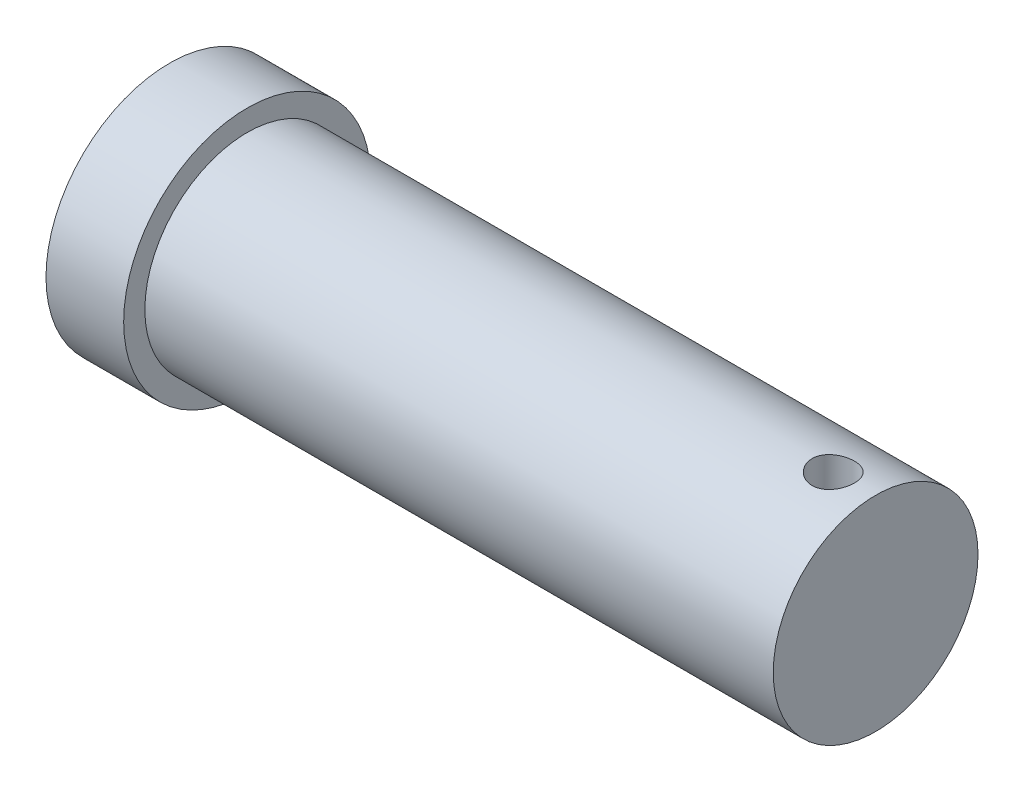
ISO-10303-21;
HEADER;
FILE_DESCRIPTION(('STEP AP214'),'2;1');
FILE_NAME('part.step','',(''),(''),'','','');
FILE_SCHEMA(('AUTOMOTIVE_DESIGN { 1 0 10303 214 1 1 1 1 }'));
ENDSEC;
DATA;
#1=APPLICATION_CONTEXT('core data for automotive mechanical design processes');
#2=APPLICATION_PROTOCOL_DEFINITION('international standard','automotive_design',2000,#1);
#3=PRODUCT_CONTEXT('',#1,'mechanical');
#4=PRODUCT('Part','Part','',(#3));
#5=PRODUCT_RELATED_PRODUCT_CATEGORY('part','',(#4));
#6=PRODUCT_DEFINITION_FORMATION('','',#4);
#7=PRODUCT_DEFINITION_CONTEXT('part definition',#1,'design');
#8=PRODUCT_DEFINITION('design','',#6,#7);
#9=PRODUCT_DEFINITION_SHAPE('','',#8);
#10=(LENGTH_UNIT() NAMED_UNIT(*) SI_UNIT(.MILLI.,.METRE.));
#11=(NAMED_UNIT(*) PLANE_ANGLE_UNIT() SI_UNIT($,.RADIAN.));
#12=(NAMED_UNIT(*) SI_UNIT($,.STERADIAN.) SOLID_ANGLE_UNIT());
#13=UNCERTAINTY_MEASURE_WITH_UNIT(LENGTH_MEASURE(1.E-05),#10,'distance_accuracy_value','');
#14=(GEOMETRIC_REPRESENTATION_CONTEXT(3) GLOBAL_UNCERTAINTY_ASSIGNED_CONTEXT((#13)) GLOBAL_UNIT_ASSIGNED_CONTEXT((#10,
#11,#12)) REPRESENTATION_CONTEXT('',''));
#15=CARTESIAN_POINT('',(0.,0.,0.));
#16=DIRECTION('',(0.,0.,1.));
#17=DIRECTION('',(1.,0.,0.));
#18=AXIS2_PLACEMENT_3D('',#15,#16,#17);
#19=CARTESIAN_POINT('',(30.,0.,0.));
#20=DIRECTION('',(-1.,0.,0.));
#21=DIRECTION('',(0.,0.,1.));
#22=AXIS2_PLACEMENT_3D('',#19,#20,#21);
#23=CYLINDRICAL_SURFACE('',#22,4.35);
#24=CARTESIAN_POINT('',(28.2,4.25587828773333,-0.9));
#25=CARTESIAN_POINT('',(28.1500305667891,4.25587929095094,-0.899998196400328));
#26=CARTESIAN_POINT('',(28.1000387975526,4.2567679202837,-0.895824284722911));
#27=CARTESIAN_POINT('',(28.0014721562803,4.2602207333907,-0.879254387946158));
#28=CARTESIAN_POINT('',(27.9528984089688,4.26278621137933,-0.866852051926724));
#29=CARTESIAN_POINT('',(27.8586079990274,4.26929001357867,-0.834228573902196));
#30=CARTESIAN_POINT('',(27.8128884462164,4.27322692157799,-0.814015495340268));
#31=CARTESIAN_POINT('',(27.7254898627765,4.28202830191164,-0.766366756372086));
#32=CARTESIAN_POINT('',(27.6838106580962,4.28689273426296,-0.738931407278501));
#33=CARTESIAN_POINT('',(27.6050438494152,4.29708326529664,-0.67717457207116));
#34=CARTESIAN_POINT('',(27.5680262558738,4.30241473461027,-0.642764663727479));
#35=CARTESIAN_POINT('',(27.5002453657917,4.31289143953721,-0.568226470167501));
#36=CARTESIAN_POINT('',(27.4694825243583,4.31803666157645,-0.528097769202458));
#37=CARTESIAN_POINT('',(27.414810812997,4.32761927534465,-0.44279538964346));
#38=CARTESIAN_POINT('',(27.3909687651315,4.33204959385009,-0.397578020878248));
#39=CARTESIAN_POINT('',(27.3512470223856,4.33964277247555,-0.303671938110153));
#40=CARTESIAN_POINT('',(27.3353665293521,4.34280575964028,-0.254983572636992));
#41=CARTESIAN_POINT('',(27.3122374393062,4.34746994667023,-0.156244668235882));
#42=CARTESIAN_POINT('',(27.3048705204984,4.34899390456592,-0.106222938615976));
#43=CARTESIAN_POINT('',(27.2986082588322,4.35028701378942,-0.00563189495462432));
#44=CARTESIAN_POINT('',(27.2997120448303,4.35005634556637,0.0449373622439072));
#45=CARTESIAN_POINT('',(27.3102706975022,4.34788374064047,0.144373995140225));
#46=CARTESIAN_POINT('',(27.3195980832215,4.3459679278419,0.193255561537902));
#47=CARTESIAN_POINT('',(27.3461366251204,4.34066986259437,0.288744332839902));
#48=CARTESIAN_POINT('',(27.3633481120404,4.33728754862558,0.335351442239309));
#49=CARTESIAN_POINT('',(27.4052824617628,4.32939383532823,0.425328456076219));
#50=CARTESIAN_POINT('',(27.4300546852684,4.32487505167294,0.468674681318767));
#51=CARTESIAN_POINT('',(27.4863706924743,4.31520559962186,0.550641923251581));
#52=CARTESIAN_POINT('',(27.5179153071199,4.3100548537201,0.589262359192746));
#53=CARTESIAN_POINT('',(27.5875781317007,4.29957620303471,0.661438887911584));
#54=CARTESIAN_POINT('',(27.6258079168448,4.29424678564393,0.694887158392287));
#55=CARTESIAN_POINT('',(27.7073884669969,4.28410212057788,0.75491629192489));
#56=CARTESIAN_POINT('',(27.7507393429196,4.27928688404326,0.781497006196732));
#57=CARTESIAN_POINT('',(27.8414933010424,4.27071242032867,0.827077490461711));
#58=CARTESIAN_POINT('',(27.8889059334576,4.266955776261,0.846058763404702));
#59=CARTESIAN_POINT('',(27.9863434940012,4.26096091944167,0.875753316020067));
#60=CARTESIAN_POINT('',(28.0363680544338,4.25872249357938,0.886467756127805));
#61=CARTESIAN_POINT('',(28.1366293574232,4.25606049308508,0.899161177068869));
#62=CARTESIAN_POINT('',(28.1868454897143,4.25560447784649,0.901296324920282));
#63=CARTESIAN_POINT('',(28.2869162940659,4.25647169716887,0.897191706534911));
#64=CARTESIAN_POINT('',(28.3367709879746,4.25779482326761,0.890952450828975));
#65=CARTESIAN_POINT('',(28.4341720822165,4.26204077107077,0.870411082485175));
#66=CARTESIAN_POINT('',(28.4817370704288,4.26494684619859,0.856193330402416));
#67=CARTESIAN_POINT('',(28.573809815987,4.27201641499332,0.820189167659232));
#68=CARTESIAN_POINT('',(28.6183173061847,4.27618001836538,0.798402096636112));
#69=CARTESIAN_POINT('',(28.7036923030148,4.28536781518625,0.747527640417251));
#70=CARTESIAN_POINT('',(28.7445006803829,4.29040315633667,0.718343080666635));
#71=CARTESIAN_POINT('',(28.8206979170486,4.30073691769877,0.653630763347126));
#72=CARTESIAN_POINT('',(28.8560861766584,4.30603536693525,0.618102304822835));
#73=CARTESIAN_POINT('',(28.9210357665708,4.31640422339455,0.541007620847438));
#74=CARTESIAN_POINT('',(28.9504911882524,4.32146941794191,0.499351354577219));
#75=CARTESIAN_POINT('',(29.0019855655522,4.33070857791662,0.41159097561314));
#76=CARTESIAN_POINT('',(29.0240248461368,4.33488258239191,0.36548705792394));
#77=CARTESIAN_POINT('',(29.0599094080132,4.34184690410449,0.270410359500704));
#78=CARTESIAN_POINT('',(29.0738032370773,4.34464540300103,0.221456528183164));
#79=CARTESIAN_POINT('',(29.0931555833511,4.34857859466957,0.121845856169587));
#80=CARTESIAN_POINT('',(29.0986151914316,4.34971350260725,0.0711892365760125));
#81=CARTESIAN_POINT('',(29.1008994212102,4.35018608442621,-0.029379711640951));
#82=CARTESIAN_POINT('',(29.0978828678693,4.34955681567088,-0.0792883449744838));
#83=CARTESIAN_POINT('',(29.0836527263498,4.34664172584998,-0.17787099577158));
#84=CARTESIAN_POINT('',(29.0724392564487,4.34435592868732,-0.226545031039303));
#85=CARTESIAN_POINT('',(29.0422062120229,4.33838609630131,-0.32116924827165));
#86=CARTESIAN_POINT('',(29.0232069639925,4.33470570384782,-0.367126169022308));
#87=CARTESIAN_POINT('',(28.9779624080306,4.32634177084745,-0.455222079711153));
#88=CARTESIAN_POINT('',(28.951716479225,4.32165814435418,-0.497360742101233));
#89=CARTESIAN_POINT('',(28.8921942213405,4.31170029471696,-0.577405562244912));
#90=CARTESIAN_POINT('',(28.8588049466148,4.30641731382222,-0.615226651720255));
#91=CARTESIAN_POINT('',(28.7861743753579,4.29590641372543,-0.684783535924426));
#92=CARTESIAN_POINT('',(28.7469316871842,4.29067850793474,-0.716517879423625));
#93=CARTESIAN_POINT('',(28.6631576765564,4.28080213071321,-0.773354541325504));
#94=CARTESIAN_POINT('',(28.6185699266925,4.27616114184269,-0.798375051967325));
#95=CARTESIAN_POINT('',(28.525738224137,4.26807636821564,-0.840528661857262));
#96=CARTESIAN_POINT('',(28.4774975534878,4.26463152394578,-0.857668745764421));
#97=CARTESIAN_POINT('',(28.3909736821843,4.25999868652961,-0.880345088311999));
#98=CARTESIAN_POINT('',(28.3531757234354,4.25846335283765,-0.887702158728667));
#99=CARTESIAN_POINT('',(28.2769229050015,4.25640278708347,-0.897530213037355));
#100=CARTESIAN_POINT('',(28.2384680711273,4.25587751542426,-0.90000138846883));
#101=CARTESIAN_POINT('',(28.2,4.25587828773333,-0.9));
#102=B_SPLINE_CURVE_WITH_KNOTS('',3,(#24,#25,#26,#27,#28,#29,#30,#31,#32,#33,#34,#35,#36,#37,
#38,#39,#40,#41,#42,#43,#44,#45,#46,#47,#48,#49,#50,#51,#52,#53,#54,#55,#56,#57,#58,#59,#60,#61,
#62,#63,#64,#65,#66,#67,#68,#69,#70,#71,#72,#73,#74,#75,#76,#77,#78,#79,#80,#81,#82,#83,#84,#85,
#86,#87,#88,#89,#90,#91,#92,#93,#94,#95,#96,#97,#98,#99,#100,#101),.UNSPECIFIED.,.T.,.F.,(4,2,2,
2,2,2,2,2,2,2,2,2,2,2,2,2,2,2,2,2,2,2,2,2,2,2,2,2,2,2,2,2,2,2,2,2,2,2,4),(0.,0.149767403663018,
0.299650536537563,0.449379348723872,0.599101707974687,0.750856517123247,0.902622364281255,
1.05580820395017,1.208978683529,1.35999377752573,1.51099334104952,1.65969249743192,
1.80839789235937,1.95809567397115,2.10781183340781,2.26031880069988,2.41282907165522,
2.56570832840206,2.71856612121079,2.86862851677755,3.01868176446863,3.16717753536402,
3.31568626458539,3.46625726137068,3.61684490547984,3.76992004060513,3.92298846728882,
4.07513506278004,4.22726197818602,4.37655747427177,4.52585081613914,4.67475685300922,
4.82367565166798,4.97515068654527,5.12666179201653,5.27994288485831,5.43308785690734,
5.54838812420844,5.66368387135748),.UNSPECIFIED.);
#103=CARTESIAN_POINT('',(28.2,4.25587828773333,-0.9));
#104=VERTEX_POINT('',#103);
#105=EDGE_CURVE('E54',#104,#104,#102,.T.);
#106=ORIENTED_EDGE('',*,*,#105,.F.);
#107=EDGE_LOOP('',(#106));
#108=FACE_BOUND('',#107,.T.);
#109=CARTESIAN_POINT('',(28.2,-4.25587828773333,-0.9));
#110=CARTESIAN_POINT('',(28.2499694332109,-4.25587929095094,-0.899998196400328));
#111=CARTESIAN_POINT('',(28.2999612024474,-4.2567679202837,-0.895824284722912));
#112=CARTESIAN_POINT('',(28.3985278437197,-4.2602207333907,-0.879254387946158));
#113=CARTESIAN_POINT('',(28.4471015910312,-4.26278621137933,-0.866852051926724));
#114=CARTESIAN_POINT('',(28.5413920009726,-4.26929001357867,-0.834228573902196));
#115=CARTESIAN_POINT('',(28.5871115537836,-4.27322692157799,-0.814015495340268));
#116=CARTESIAN_POINT('',(28.6745101372235,-4.28202830191164,-0.766366756372086));
#117=CARTESIAN_POINT('',(28.7161893419038,-4.28689273426296,-0.7389314072785));
#118=CARTESIAN_POINT('',(28.7949561505848,-4.29708326529664,-0.67717457207116));
#119=CARTESIAN_POINT('',(28.8319737441262,-4.30241473461027,-0.642764663727479));
#120=CARTESIAN_POINT('',(28.8997546342083,-4.31289143953721,-0.568226470167501));
#121=CARTESIAN_POINT('',(28.9305174756417,-4.31803666157645,-0.528097769202457));
#122=CARTESIAN_POINT('',(28.985189187003,-4.32761927534465,-0.44279538964346));
#123=CARTESIAN_POINT('',(29.0090312348685,-4.33204959385009,-0.397578020878249));
#124=CARTESIAN_POINT('',(29.0487529776144,-4.33964277247555,-0.303671938110154));
#125=CARTESIAN_POINT('',(29.0646334706479,-4.34280575964028,-0.254983572636993));
#126=CARTESIAN_POINT('',(29.0877625606938,-4.34746994667023,-0.156244668235882));
#127=CARTESIAN_POINT('',(29.0951294795016,-4.34899390456592,-0.106222938615975));
#128=CARTESIAN_POINT('',(29.1013917411678,-4.35028701378942,-0.00563189495462437));
#129=CARTESIAN_POINT('',(29.1002879551697,-4.35005634556637,0.044937362243907));
#130=CARTESIAN_POINT('',(29.0897293024978,-4.34788374064047,0.144373995140226));
#131=CARTESIAN_POINT('',(29.0804019167785,-4.3459679278419,0.193255561537903));
#132=CARTESIAN_POINT('',(29.0538633748796,-4.34066986259437,0.288744332839903));
#133=CARTESIAN_POINT('',(29.0366518879596,-4.33728754862558,0.335351442239308));
#134=CARTESIAN_POINT('',(28.9947175382372,-4.32939383532823,0.425328456076219));
#135=CARTESIAN_POINT('',(28.9699453147316,-4.32487505167294,0.46867468131877));
#136=CARTESIAN_POINT('',(28.9136293075257,-4.31520559962186,0.550641923251584));
#137=CARTESIAN_POINT('',(28.8820846928801,-4.3100548537201,0.589262359192747));
#138=CARTESIAN_POINT('',(28.8124218682993,-4.29957620303471,0.661438887911585));
#139=CARTESIAN_POINT('',(28.7741920831552,-4.29424678564392,0.694887158392291));
#140=CARTESIAN_POINT('',(28.6926115330031,-4.28410212057788,0.754916291924894));
#141=CARTESIAN_POINT('',(28.6492606570804,-4.27928688404326,0.781497006196733));
#142=CARTESIAN_POINT('',(28.5585066989576,-4.27071242032867,0.82707749046171));
#143=CARTESIAN_POINT('',(28.5110940665424,-4.266955776261,0.846058763404702));
#144=CARTESIAN_POINT('',(28.4136565059988,-4.26096091944167,0.875753316020068));
#145=CARTESIAN_POINT('',(28.3636319455662,-4.25872249357938,0.886467756127805));
#146=CARTESIAN_POINT('',(28.2633706425768,-4.25606049308508,0.899161177068869));
#147=CARTESIAN_POINT('',(28.2131545102857,-4.25560447784649,0.901296324920282));
#148=CARTESIAN_POINT('',(28.1130837059341,-4.25647169716887,0.897191706534911));
#149=CARTESIAN_POINT('',(28.0632290120254,-4.25779482326761,0.890952450828975));
#150=CARTESIAN_POINT('',(27.9658279177835,-4.26204077107077,0.870411082485175));
#151=CARTESIAN_POINT('',(27.9182629295712,-4.26494684619859,0.856193330402414));
#152=CARTESIAN_POINT('',(27.826190184013,-4.27201641499332,0.82018916765923));
#153=CARTESIAN_POINT('',(27.7816826938153,-4.27618001836538,0.798402096636111));
#154=CARTESIAN_POINT('',(27.6963076969852,-4.28536781518625,0.747527640417251));
#155=CARTESIAN_POINT('',(27.6554993196171,-4.29040315633667,0.718343080666634));
#156=CARTESIAN_POINT('',(27.5793020829514,-4.30073691769877,0.653630763347124));
#157=CARTESIAN_POINT('',(27.5439138233416,-4.30603536693525,0.618102304822835));
#158=CARTESIAN_POINT('',(27.4789642334292,-4.31640422339455,0.541007620847437));
#159=CARTESIAN_POINT('',(27.4495088117476,-4.32146941794191,0.499351354577217));
#160=CARTESIAN_POINT('',(27.3980144344478,-4.33070857791662,0.411590975613138));
#161=CARTESIAN_POINT('',(27.3759751538632,-4.33488258239191,0.365487057923939));
#162=CARTESIAN_POINT('',(27.3400905919868,-4.34184690410449,0.270410359500703));
#163=CARTESIAN_POINT('',(27.3261967629227,-4.34464540300103,0.221456528183162));
#164=CARTESIAN_POINT('',(27.3068444166489,-4.34857859466957,0.121845856169585));
#165=CARTESIAN_POINT('',(27.3013848085684,-4.34971350260725,0.0711892365760117));
#166=CARTESIAN_POINT('',(27.2991005787899,-4.35018608442621,-0.0293797116409506));
#167=CARTESIAN_POINT('',(27.3021171321307,-4.34955681567088,-0.0792883449744832));
#168=CARTESIAN_POINT('',(27.3163472736502,-4.34664172584998,-0.177870995771579));
#169=CARTESIAN_POINT('',(27.3275607435513,-4.34435592868732,-0.226545031039303));
#170=CARTESIAN_POINT('',(27.3577937879771,-4.33838609630131,-0.32116924827165));
#171=CARTESIAN_POINT('',(27.3767930360075,-4.33470570384782,-0.367126169022305));
#172=CARTESIAN_POINT('',(27.4220375919694,-4.32634177084745,-0.455222079711151));
#173=CARTESIAN_POINT('',(27.448283520775,-4.32165814435418,-0.497360742101233));
#174=CARTESIAN_POINT('',(27.5078057786595,-4.31170029471696,-0.577405562244911));
#175=CARTESIAN_POINT('',(27.5411950533852,-4.30641731382222,-0.615226651720252));
#176=CARTESIAN_POINT('',(27.6138256246421,-4.29590641372543,-0.684783535924423));
#177=CARTESIAN_POINT('',(27.6530683128158,-4.29067850793474,-0.716517879423625));
#178=CARTESIAN_POINT('',(27.7368423234436,-4.28080213071321,-0.773354541325505));
#179=CARTESIAN_POINT('',(27.7814300733075,-4.27616114184269,-0.798375051967324));
#180=CARTESIAN_POINT('',(27.874261775863,-4.26807636821564,-0.840528661857261));
#181=CARTESIAN_POINT('',(27.9225024465122,-4.26463152394578,-0.857668745764421));
#182=CARTESIAN_POINT('',(28.0090263178158,-4.25999868652961,-0.880345088311999));
#183=CARTESIAN_POINT('',(28.0468242765646,-4.25846335283765,-0.887702158728667));
#184=CARTESIAN_POINT('',(28.1230770949985,-4.25640278708347,-0.897530213037355));
#185=CARTESIAN_POINT('',(28.1615319288727,-4.25587751542426,-0.90000138846883));
#186=CARTESIAN_POINT('',(28.2,-4.25587828773333,-0.9));
#187=B_SPLINE_CURVE_WITH_KNOTS('',3,(#109,#110,#111,#112,#113,#114,#115,#116,#117,#118,#119,
#120,#121,#122,#123,#124,#125,#126,#127,#128,#129,#130,#131,#132,#133,#134,#135,#136,#137,#138,
#139,#140,#141,#142,#143,#144,#145,#146,#147,#148,#149,#150,#151,#152,#153,#154,#155,#156,#157,
#158,#159,#160,#161,#162,#163,#164,#165,#166,#167,#168,#169,#170,#171,#172,#173,#174,#175,#176,
#177,#178,#179,#180,#181,#182,#183,#184,#185,#186),.UNSPECIFIED.,.T.,.F.,(4,2,2,2,2,2,2,2,2,2,2,
2,2,2,2,2,2,2,2,2,2,2,2,2,2,2,2,2,2,2,2,2,2,2,2,2,2,2,4),(0.,0.149767403663015,0.29965053653756,
0.449379348723876,0.599101707974687,0.750856517123247,0.902622364281252,1.05580820395017,
1.20897868352899,1.35999377752573,1.51099334104952,1.65969249743192,1.80839789235937,
1.95809567397115,2.10781183340781,2.26031880069989,2.41282907165522,2.56570832840205,
2.71856612121079,2.86862851677755,3.01868176446863,3.16717753536403,3.31568626458539,
3.46625726137068,3.61684490547984,3.76992004060514,3.92298846728882,4.07513506278005,
4.22726197818602,4.37655747427177,4.52585081613914,4.67475685300922,4.82367565166798,
4.97515068654527,5.12666179201653,5.2799428848583,5.43308785690734,5.54838812420844,
5.66368387135748),.UNSPECIFIED.);
#188=CARTESIAN_POINT('',(28.2,-4.25587828773333,-0.9));
#189=VERTEX_POINT('',#188);
#190=EDGE_CURVE('E60',#189,#189,#187,.T.);
#191=ORIENTED_EDGE('',*,*,#190,.F.);
#192=EDGE_LOOP('',(#191));
#193=FACE_BOUND('',#192,.T.);
#194=CARTESIAN_POINT('',(30.,0.,0.));
#195=DIRECTION('',(1.,0.,0.));
#196=DIRECTION('',(0.,0.,-1.));
#197=AXIS2_PLACEMENT_3D('',#194,#195,#196);
#198=CIRCLE('',#197,4.35);
#199=CARTESIAN_POINT('',(30.,0.,-4.35));
#200=VERTEX_POINT('',#199);
#201=EDGE_CURVE('E49',#200,#200,#198,.T.);
#202=ORIENTED_EDGE('',*,*,#201,.F.);
#203=EDGE_LOOP('',(#202));
#204=FACE_BOUND('',#203,.T.);
#205=CARTESIAN_POINT('',(3.3,0.,0.));
#206=DIRECTION('',(-1.,0.,0.));
#207=DIRECTION('',(0.,0.,1.));
#208=AXIS2_PLACEMENT_3D('',#205,#206,#207);
#209=CIRCLE('',#208,4.35);
#210=CARTESIAN_POINT('',(3.3,0.,4.35));
#211=VERTEX_POINT('',#210);
#212=EDGE_CURVE('E10',#211,#211,#209,.T.);
#213=ORIENTED_EDGE('',*,*,#212,.F.);
#214=EDGE_LOOP('',(#213));
#215=FACE_BOUND('',#214,.T.);
#216=ADVANCED_FACE('F41',(#108,#193,#204,#215),#23,.T.);
#217=CARTESIAN_POINT('',(30.,0.,0.));
#218=DIRECTION('',(1.,0.,0.));
#219=DIRECTION('',(0.,0.,-1.));
#220=AXIS2_PLACEMENT_3D('',#217,#218,#219);
#221=PLANE('',#220);
#222=ORIENTED_EDGE('',*,*,#201,.T.);
#223=EDGE_LOOP('',(#222));
#224=FACE_BOUND('',#223,.T.);
#225=ADVANCED_FACE('F81',(#224),#221,.T.);
#226=CARTESIAN_POINT('',(28.2,15.,0.));
#227=DIRECTION('',(0.,-1.,0.));
#228=DIRECTION('',(0.,0.,-1.));
#229=AXIS2_PLACEMENT_3D('',#226,#227,#228);
#230=CYLINDRICAL_SURFACE('',#229,0.9);
#231=ORIENTED_EDGE('',*,*,#190,.T.);
#232=EDGE_LOOP('',(#231));
#233=FACE_BOUND('',#232,.T.);
#234=ORIENTED_EDGE('',*,*,#105,.T.);
#235=EDGE_LOOP('',(#234));
#236=FACE_BOUND('',#235,.T.);
#237=ADVANCED_FACE('F75',(#233,#236),#230,.F.);
#238=CARTESIAN_POINT('',(3.3,0.,0.));
#239=DIRECTION('',(-1.,0.,0.));
#240=DIRECTION('',(0.,0.,1.));
#241=AXIS2_PLACEMENT_3D('',#238,#239,#240);
#242=CYLINDRICAL_SURFACE('',#241,5.25);
#243=CARTESIAN_POINT('',(3.3,0.,0.));
#244=DIRECTION('',(-1.,0.,0.));
#245=DIRECTION('',(0.,0.,1.));
#246=AXIS2_PLACEMENT_3D('',#243,#244,#245);
#247=CIRCLE('',#246,5.25);
#248=CARTESIAN_POINT('',(3.3,0.,5.25));
#249=VERTEX_POINT('',#248);
#250=EDGE_CURVE('E71',#249,#249,#247,.T.);
#251=ORIENTED_EDGE('',*,*,#250,.T.);
#252=EDGE_LOOP('',(#251));
#253=FACE_BOUND('',#252,.T.);
#254=CARTESIAN_POINT('',(0.,0.,0.));
#255=DIRECTION('',(-1.,0.,0.));
#256=DIRECTION('',(0.,0.,1.));
#257=AXIS2_PLACEMENT_3D('',#254,#255,#256);
#258=CIRCLE('',#257,5.25);
#259=CARTESIAN_POINT('',(0.,0.,5.25));
#260=VERTEX_POINT('',#259);
#261=EDGE_CURVE('E63',#260,#260,#258,.T.);
#262=ORIENTED_EDGE('',*,*,#261,.F.);
#263=EDGE_LOOP('',(#262));
#264=FACE_BOUND('',#263,.T.);
#265=ADVANCED_FACE('F80',(#253,#264),#242,.T.);
#266=CARTESIAN_POINT('',(3.3,0.,0.));
#267=DIRECTION('',(-1.,0.,0.));
#268=DIRECTION('',(0.,0.,1.));
#269=AXIS2_PLACEMENT_3D('',#266,#267,#268);
#270=PLANE('',#269);
#271=ORIENTED_EDGE('',*,*,#212,.T.);
#272=EDGE_LOOP('',(#271));
#273=FACE_BOUND('',#272,.T.);
#274=ORIENTED_EDGE('',*,*,#250,.F.);
#275=EDGE_LOOP('',(#274));
#276=FACE_BOUND('',#275,.T.);
#277=ADVANCED_FACE('F88',(#273,#276),#270,.F.);
#278=CARTESIAN_POINT('',(0.,0.,0.));
#279=DIRECTION('',(1.,0.,0.));
#280=DIRECTION('',(0.,0.,-1.));
#281=AXIS2_PLACEMENT_3D('',#278,#279,#280);
#282=PLANE('',#281);
#283=ORIENTED_EDGE('',*,*,#261,.T.);
#284=EDGE_LOOP('',(#283));
#285=FACE_BOUND('',#284,.T.);
#286=ADVANCED_FACE('F86',(#285),#282,.F.);
#287=CLOSED_SHELL('',(#216,#225,#237,#265,#277,#286));
#288=MANIFOLD_SOLID_BREP('B2',#287);
#289=ADVANCED_BREP_SHAPE_REPRESENTATION('',(#18,#288),#14);
#290=SHAPE_DEFINITION_REPRESENTATION(#9,#289);
ENDSEC;
END-ISO-10303-21;
